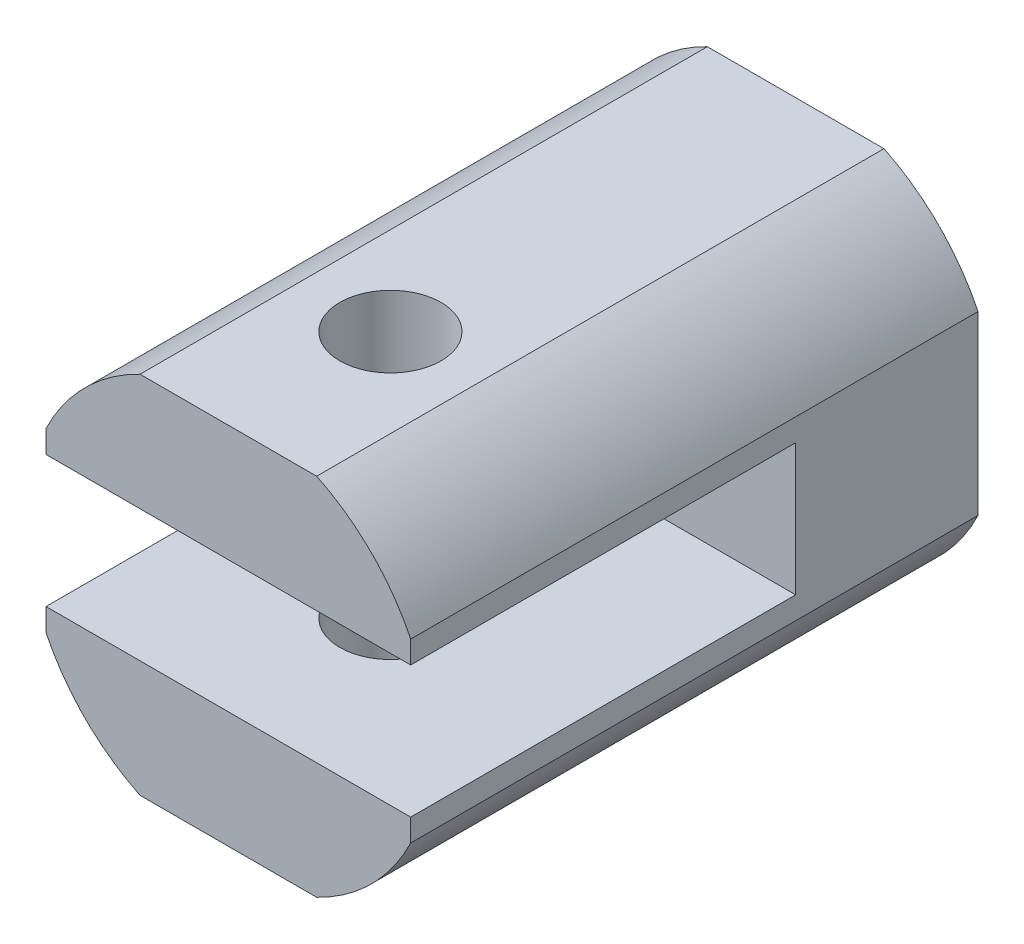
ISO-10303-21;
HEADER;
FILE_DESCRIPTION(('STEP AP214'),'2;1');
FILE_NAME('part.step','',(''),(''),'','','');
FILE_SCHEMA(('AUTOMOTIVE_DESIGN { 1 0 10303 214 1 1 1 1 }'));
ENDSEC;
DATA;
#1=APPLICATION_CONTEXT('core data for automotive mechanical design processes');
#2=APPLICATION_PROTOCOL_DEFINITION('international standard','automotive_design',2000,#1);
#3=PRODUCT_CONTEXT('',#1,'mechanical');
#4=PRODUCT('Part','Part','',(#3));
#5=PRODUCT_RELATED_PRODUCT_CATEGORY('part','',(#4));
#6=PRODUCT_DEFINITION_FORMATION('','',#4);
#7=PRODUCT_DEFINITION_CONTEXT('part definition',#1,'design');
#8=PRODUCT_DEFINITION('design','',#6,#7);
#9=PRODUCT_DEFINITION_SHAPE('','',#8);
#10=(LENGTH_UNIT() NAMED_UNIT(*) SI_UNIT(.MILLI.,.METRE.));
#11=(NAMED_UNIT(*) PLANE_ANGLE_UNIT() SI_UNIT($,.RADIAN.));
#12=(NAMED_UNIT(*) SI_UNIT($,.STERADIAN.) SOLID_ANGLE_UNIT());
#13=UNCERTAINTY_MEASURE_WITH_UNIT(LENGTH_MEASURE(1.E-05),#10,'distance_accuracy_value','');
#14=(GEOMETRIC_REPRESENTATION_CONTEXT(3) GLOBAL_UNCERTAINTY_ASSIGNED_CONTEXT((#13)) GLOBAL_UNIT_ASSIGNED_CONTEXT((#10,
#11,#12)) REPRESENTATION_CONTEXT('',''));
#15=CARTESIAN_POINT('',(0.,0.,0.));
#16=DIRECTION('',(0.,0.,1.));
#17=DIRECTION('',(1.,0.,0.));
#18=AXIS2_PLACEMENT_3D('',#15,#16,#17);
#19=CARTESIAN_POINT('',(0.,0.,0.));
#20=DIRECTION('',(0.,0.,1.));
#21=DIRECTION('',(1.,0.,0.));
#22=AXIS2_PLACEMENT_3D('',#19,#20,#21);
#23=PLANE('',#22);
#24=DIRECTION('',(1.,0.,0.));
#25=VECTOR('',#24,1.);
#26=CARTESIAN_POINT('',(-9.,-3.25,0.));
#27=LINE('',#26,#25);
#28=CARTESIAN_POINT('',(-9.,-3.25,0.));
#29=VERTEX_POINT('',#28);
#30=CARTESIAN_POINT('',(9.,-3.25,0.));
#31=VERTEX_POINT('',#30);
#32=EDGE_CURVE('E188',#29,#31,#27,.T.);
#33=ORIENTED_EDGE('',*,*,#32,.F.);
#34=DIRECTION('',(0.,-1.,0.));
#35=VECTOR('',#34,1.);
#36=CARTESIAN_POINT('',(-9.00000000000001,4.35889894354066,0.));
#37=LINE('',#36,#35);
#38=CARTESIAN_POINT('',(-9.00000000000001,-4.35889894354066,0.));
#39=VERTEX_POINT('',#38);
#40=EDGE_CURVE('E96',#29,#39,#37,.T.);
#41=ORIENTED_EDGE('',*,*,#40,.T.);
#42=CARTESIAN_POINT('',(0.,0.,0.));
#43=DIRECTION('',(0.,0.,1.));
#44=DIRECTION('',(1.,0.,0.));
#45=AXIS2_PLACEMENT_3D('',#42,#43,#44);
#46=CIRCLE('',#45,10.);
#47=CARTESIAN_POINT('',(-4.35889894354067,-9.,0.));
#48=VERTEX_POINT('',#47);
#49=EDGE_CURVE('E153',#39,#48,#46,.T.);
#50=ORIENTED_EDGE('',*,*,#49,.T.);
#51=DIRECTION('',(1.,0.,0.));
#52=VECTOR('',#51,1.);
#53=CARTESIAN_POINT('',(-4.35889894354067,-9.,0.));
#54=LINE('',#53,#52);
#55=CARTESIAN_POINT('',(4.35889894354067,-9.,0.));
#56=VERTEX_POINT('',#55);
#57=EDGE_CURVE('E155',#48,#56,#54,.T.);
#58=ORIENTED_EDGE('',*,*,#57,.T.);
#59=CARTESIAN_POINT('',(0.,0.,0.));
#60=DIRECTION('',(0.,0.,1.));
#61=DIRECTION('',(1.,0.,0.));
#62=AXIS2_PLACEMENT_3D('',#59,#60,#61);
#63=CIRCLE('',#62,10.);
#64=CARTESIAN_POINT('',(9.,-4.35889894354067,0.));
#65=VERTEX_POINT('',#64);
#66=EDGE_CURVE('E159',#56,#65,#63,.T.);
#67=ORIENTED_EDGE('',*,*,#66,.T.);
#68=DIRECTION('',(0.,1.,0.));
#69=VECTOR('',#68,1.);
#70=CARTESIAN_POINT('',(9.,4.35889894354067,0.));
#71=LINE('',#70,#69);
#72=EDGE_CURVE('E163',#65,#31,#71,.T.);
#73=ORIENTED_EDGE('',*,*,#72,.T.);
#74=EDGE_LOOP('',(#33,#41,#50,#58,#67,#73));
#75=FACE_BOUND('',#74,.T.);
#76=ADVANCED_FACE('F37',(#75),#23,.T.);
#77=CARTESIAN_POINT('',(0.,0.,-28.));
#78=DIRECTION('',(0.,0.,1.));
#79=DIRECTION('',(1.,0.,0.));
#80=AXIS2_PLACEMENT_3D('',#77,#78,#79);
#81=CYLINDRICAL_SURFACE('',#80,10.);
#82=ORIENTED_EDGE('',*,*,#49,.F.);
#83=DIRECTION('',(0.,0.,1.));
#84=VECTOR('',#83,1.);
#85=CARTESIAN_POINT('',(-9.00000000000001,-4.35889894354066,-28.));
#86=LINE('',#85,#84);
#87=CARTESIAN_POINT('',(-9.00000000000001,-4.35889894354066,-28.));
#88=VERTEX_POINT('',#87);
#89=EDGE_CURVE('E11',#88,#39,#86,.T.);
#90=ORIENTED_EDGE('',*,*,#89,.F.);
#91=CARTESIAN_POINT('',(0.,0.,-28.));
#92=DIRECTION('',(0.,0.,1.));
#93=DIRECTION('',(1.,0.,0.));
#94=AXIS2_PLACEMENT_3D('',#91,#92,#93);
#95=CIRCLE('',#94,10.);
#96=CARTESIAN_POINT('',(-4.35889894354067,-9.,-28.));
#97=VERTEX_POINT('',#96);
#98=EDGE_CURVE('E174',#88,#97,#95,.T.);
#99=ORIENTED_EDGE('',*,*,#98,.T.);
#100=DIRECTION('',(0.,0.,1.));
#101=VECTOR('',#100,1.);
#102=CARTESIAN_POINT('',(-4.35889894354067,-9.,-28.));
#103=LINE('',#102,#101);
#104=EDGE_CURVE('E103',#97,#48,#103,.T.);
#105=ORIENTED_EDGE('',*,*,#104,.T.);
#106=EDGE_LOOP('',(#82,#90,#99,#105));
#107=FACE_BOUND('',#106,.T.);
#108=ADVANCED_FACE('F39',(#107),#81,.T.);
#109=CARTESIAN_POINT('',(-9.00000000000001,4.35889894354066,-28.));
#110=DIRECTION('',(-1.,0.,0.));
#111=DIRECTION('',(0.,0.,1.));
#112=AXIS2_PLACEMENT_3D('',#109,#110,#111);
#113=PLANE('',#112);
#114=DIRECTION('',(0.,0.,1.));
#115=VECTOR('',#114,1.);
#116=CARTESIAN_POINT('',(-9.,-3.25,-19.));
#117=LINE('',#116,#115);
#118=CARTESIAN_POINT('',(-9.,-3.25,-19.));
#119=VERTEX_POINT('',#118);
#120=EDGE_CURVE('E235',#119,#29,#117,.T.);
#121=ORIENTED_EDGE('',*,*,#120,.F.);
#122=DIRECTION('',(0.,-1.,0.));
#123=VECTOR('',#122,1.);
#124=CARTESIAN_POINT('',(-9.,3.25,-19.));
#125=LINE('',#124,#123);
#126=CARTESIAN_POINT('',(-9.,3.25,-19.));
#127=VERTEX_POINT('',#126);
#128=EDGE_CURVE('E232',#127,#119,#125,.T.);
#129=ORIENTED_EDGE('',*,*,#128,.F.);
#130=DIRECTION('',(0.,0.,1.));
#131=VECTOR('',#130,1.);
#132=CARTESIAN_POINT('',(-9.,3.25,-19.));
#133=LINE('',#132,#131);
#134=CARTESIAN_POINT('',(-9.,3.25,0.));
#135=VERTEX_POINT('',#134);
#136=EDGE_CURVE('E229',#127,#135,#133,.T.);
#137=ORIENTED_EDGE('',*,*,#136,.T.);
#138=CARTESIAN_POINT('',(-9.00000000000001,4.35889894354066,0.));
#139=VERTEX_POINT('',#138);
#140=EDGE_CURVE('E172',#139,#135,#37,.T.);
#141=ORIENTED_EDGE('',*,*,#140,.F.);
#142=DIRECTION('',(0.,0.,1.));
#143=VECTOR('',#142,1.);
#144=CARTESIAN_POINT('',(-9.00000000000001,4.35889894354066,-28.));
#145=LINE('',#144,#143);
#146=CARTESIAN_POINT('',(-9.00000000000001,4.35889894354066,-28.));
#147=VERTEX_POINT('',#146);
#148=EDGE_CURVE('E46',#147,#139,#145,.T.);
#149=ORIENTED_EDGE('',*,*,#148,.F.);
#150=DIRECTION('',(0.,-1.,0.));
#151=VECTOR('',#150,1.);
#152=CARTESIAN_POINT('',(-9.00000000000001,4.35889894354066,-28.));
#153=LINE('',#152,#151);
#154=EDGE_CURVE('E143',#147,#88,#153,.T.);
#155=ORIENTED_EDGE('',*,*,#154,.T.);
#156=ORIENTED_EDGE('',*,*,#89,.T.);
#157=ORIENTED_EDGE('',*,*,#40,.F.);
#158=EDGE_LOOP('',(#121,#129,#137,#141,#149,#155,#156,#157));
#159=FACE_BOUND('',#158,.T.);
#160=ADVANCED_FACE('F195',(#159),#113,.T.);
#161=CARTESIAN_POINT('',(0.,0.,-28.));
#162=DIRECTION('',(0.,0.,1.));
#163=DIRECTION('',(1.,0.,0.));
#164=AXIS2_PLACEMENT_3D('',#161,#162,#163);
#165=CYLINDRICAL_SURFACE('',#164,10.);
#166=CARTESIAN_POINT('',(0.,0.,0.));
#167=DIRECTION('',(0.,0.,1.));
#168=DIRECTION('',(1.,0.,0.));
#169=AXIS2_PLACEMENT_3D('',#166,#167,#168);
#170=CIRCLE('',#169,10.);
#171=CARTESIAN_POINT('',(-4.35889894354067,9.,0.));
#172=VERTEX_POINT('',#171);
#173=EDGE_CURVE('E129',#172,#139,#170,.T.);
#174=ORIENTED_EDGE('',*,*,#173,.F.);
#175=DIRECTION('',(0.,0.,1.));
#176=VECTOR('',#175,1.);
#177=CARTESIAN_POINT('',(-4.35889894354067,9.,-28.));
#178=LINE('',#177,#176);
#179=CARTESIAN_POINT('',(-4.35889894354067,9.,-28.));
#180=VERTEX_POINT('',#179);
#181=EDGE_CURVE('E123',#180,#172,#178,.T.);
#182=ORIENTED_EDGE('',*,*,#181,.F.);
#183=CARTESIAN_POINT('',(0.,0.,-28.));
#184=DIRECTION('',(0.,0.,1.));
#185=DIRECTION('',(1.,0.,0.));
#186=AXIS2_PLACEMENT_3D('',#183,#184,#185);
#187=CIRCLE('',#186,10.);
#188=EDGE_CURVE('E126',#180,#147,#187,.T.);
#189=ORIENTED_EDGE('',*,*,#188,.T.);
#190=ORIENTED_EDGE('',*,*,#148,.T.);
#191=EDGE_LOOP('',(#174,#182,#189,#190));
#192=FACE_BOUND('',#191,.T.);
#193=ADVANCED_FACE('F125',(#192),#165,.T.);
#194=CARTESIAN_POINT('',(-4.35889894354067,9.,-28.));
#195=DIRECTION('',(0.,1.,0.));
#196=DIRECTION('',(0.,0.,1.));
#197=AXIS2_PLACEMENT_3D('',#194,#195,#196);
#198=PLANE('',#197);
#199=CARTESIAN_POINT('',(0.,9.,-8.));
#200=DIRECTION('',(0.,1.,0.));
#201=DIRECTION('',(0.,0.,1.));
#202=AXIS2_PLACEMENT_3D('',#199,#200,#201);
#203=CIRCLE('',#202,2.5);
#204=CARTESIAN_POINT('',(0.,9.,-5.5));
#205=VERTEX_POINT('',#204);
#206=EDGE_CURVE('E277',#205,#205,#203,.T.);
#207=ORIENTED_EDGE('',*,*,#206,.F.);
#208=EDGE_LOOP('',(#207));
#209=FACE_BOUND('',#208,.T.);
#210=DIRECTION('',(-1.,0.,0.));
#211=VECTOR('',#210,1.);
#212=CARTESIAN_POINT('',(-4.35889894354067,9.,0.));
#213=LINE('',#212,#211);
#214=CARTESIAN_POINT('',(4.35889894354067,9.,0.));
#215=VERTEX_POINT('',#214);
#216=EDGE_CURVE('E169',#215,#172,#213,.T.);
#217=ORIENTED_EDGE('',*,*,#216,.F.);
#218=DIRECTION('',(0.,0.,1.));
#219=VECTOR('',#218,1.);
#220=CARTESIAN_POINT('',(4.35889894354067,9.,-28.));
#221=LINE('',#220,#219);
#222=CARTESIAN_POINT('',(4.35889894354067,9.,-28.));
#223=VERTEX_POINT('',#222);
#224=EDGE_CURVE('E134',#223,#215,#221,.T.);
#225=ORIENTED_EDGE('',*,*,#224,.F.);
#226=DIRECTION('',(-1.,0.,0.));
#227=VECTOR('',#226,1.);
#228=CARTESIAN_POINT('',(-4.35889894354067,9.,-28.));
#229=LINE('',#228,#227);
#230=EDGE_CURVE('E140',#223,#180,#229,.T.);
#231=ORIENTED_EDGE('',*,*,#230,.T.);
#232=ORIENTED_EDGE('',*,*,#181,.T.);
#233=EDGE_LOOP('',(#217,#225,#231,#232));
#234=FACE_BOUND('',#233,.T.);
#235=ADVANCED_FACE('F145',(#209,#234),#198,.T.);
#236=CARTESIAN_POINT('',(0.,0.,-28.));
#237=DIRECTION('',(0.,0.,1.));
#238=DIRECTION('',(1.,0.,0.));
#239=AXIS2_PLACEMENT_3D('',#236,#237,#238);
#240=CYLINDRICAL_SURFACE('',#239,10.);
#241=CARTESIAN_POINT('',(0.,0.,0.));
#242=DIRECTION('',(0.,0.,1.));
#243=DIRECTION('',(1.,0.,0.));
#244=AXIS2_PLACEMENT_3D('',#241,#242,#243);
#245=CIRCLE('',#244,10.);
#246=CARTESIAN_POINT('',(9.,4.35889894354067,0.));
#247=VERTEX_POINT('',#246);
#248=EDGE_CURVE('E166',#247,#215,#245,.T.);
#249=ORIENTED_EDGE('',*,*,#248,.F.);
#250=DIRECTION('',(0.,0.,1.));
#251=VECTOR('',#250,1.);
#252=CARTESIAN_POINT('',(9.,4.35889894354067,-28.));
#253=LINE('',#252,#251);
#254=CARTESIAN_POINT('',(9.,4.35889894354067,-28.));
#255=VERTEX_POINT('',#254);
#256=EDGE_CURVE('E178',#255,#247,#253,.T.);
#257=ORIENTED_EDGE('',*,*,#256,.F.);
#258=CARTESIAN_POINT('',(0.,0.,-28.));
#259=DIRECTION('',(0.,0.,1.));
#260=DIRECTION('',(1.,0.,0.));
#261=AXIS2_PLACEMENT_3D('',#258,#259,#260);
#262=CIRCLE('',#261,10.);
#263=EDGE_CURVE('E146',#255,#223,#262,.T.);
#264=ORIENTED_EDGE('',*,*,#263,.T.);
#265=ORIENTED_EDGE('',*,*,#224,.T.);
#266=EDGE_LOOP('',(#249,#257,#264,#265));
#267=FACE_BOUND('',#266,.T.);
#268=ADVANCED_FACE('F225',(#267),#240,.T.);
#269=CARTESIAN_POINT('',(9.,4.35889894354067,-28.));
#270=DIRECTION('',(1.,0.,0.));
#271=DIRECTION('',(0.,1.,0.));
#272=AXIS2_PLACEMENT_3D('',#269,#270,#271);
#273=PLANE('',#272);
#274=DIRECTION('',(0.,0.,1.));
#275=VECTOR('',#274,1.);
#276=CARTESIAN_POINT('',(9.,-3.25,-19.));
#277=LINE('',#276,#275);
#278=CARTESIAN_POINT('',(9.,-3.25,-19.));
#279=VERTEX_POINT('',#278);
#280=EDGE_CURVE('E156',#279,#31,#277,.T.);
#281=ORIENTED_EDGE('',*,*,#280,.T.);
#282=ORIENTED_EDGE('',*,*,#72,.F.);
#283=DIRECTION('',(0.,0.,1.));
#284=VECTOR('',#283,1.);
#285=CARTESIAN_POINT('',(9.,-4.35889894354067,-28.));
#286=LINE('',#285,#284);
#287=CARTESIAN_POINT('',(9.,-4.35889894354067,-28.));
#288=VERTEX_POINT('',#287);
#289=EDGE_CURVE('E181',#288,#65,#286,.T.);
#290=ORIENTED_EDGE('',*,*,#289,.F.);
#291=DIRECTION('',(0.,1.,0.));
#292=VECTOR('',#291,1.);
#293=CARTESIAN_POINT('',(9.,4.35889894354067,-28.));
#294=LINE('',#293,#292);
#295=EDGE_CURVE('E148',#288,#255,#294,.T.);
#296=ORIENTED_EDGE('',*,*,#295,.T.);
#297=ORIENTED_EDGE('',*,*,#256,.T.);
#298=CARTESIAN_POINT('',(9.,3.25,0.));
#299=VERTEX_POINT('',#298);
#300=EDGE_CURVE('E162',#299,#247,#71,.T.);
#301=ORIENTED_EDGE('',*,*,#300,.F.);
#302=DIRECTION('',(0.,0.,1.));
#303=VECTOR('',#302,1.);
#304=CARTESIAN_POINT('',(9.,3.25,-19.));
#305=LINE('',#304,#303);
#306=CARTESIAN_POINT('',(9.,3.25,-19.));
#307=VERTEX_POINT('',#306);
#308=EDGE_CURVE('E54',#307,#299,#305,.T.);
#309=ORIENTED_EDGE('',*,*,#308,.F.);
#310=DIRECTION('',(0.,1.,0.));
#311=VECTOR('',#310,1.);
#312=CARTESIAN_POINT('',(9.,3.25,-19.));
#313=LINE('',#312,#311);
#314=EDGE_CURVE('E263',#279,#307,#313,.T.);
#315=ORIENTED_EDGE('',*,*,#314,.F.);
#316=EDGE_LOOP('',(#281,#282,#290,#296,#297,#301,#309,#315));
#317=FACE_BOUND('',#316,.T.);
#318=ADVANCED_FACE('F218',(#317),#273,.T.);
#319=CARTESIAN_POINT('',(0.,0.,-28.));
#320=DIRECTION('',(0.,0.,1.));
#321=DIRECTION('',(1.,0.,0.));
#322=AXIS2_PLACEMENT_3D('',#319,#320,#321);
#323=CYLINDRICAL_SURFACE('',#322,10.);
#324=ORIENTED_EDGE('',*,*,#66,.F.);
#325=DIRECTION('',(0.,0.,1.));
#326=VECTOR('',#325,1.);
#327=CARTESIAN_POINT('',(4.35889894354067,-9.,-28.));
#328=LINE('',#327,#326);
#329=CARTESIAN_POINT('',(4.35889894354067,-9.,-28.));
#330=VERTEX_POINT('',#329);
#331=EDGE_CURVE('E183',#330,#56,#328,.T.);
#332=ORIENTED_EDGE('',*,*,#331,.F.);
#333=CARTESIAN_POINT('',(0.,0.,-28.));
#334=DIRECTION('',(0.,0.,1.));
#335=DIRECTION('',(1.,0.,0.));
#336=AXIS2_PLACEMENT_3D('',#333,#334,#335);
#337=CIRCLE('',#336,10.);
#338=EDGE_CURVE('E246',#330,#288,#337,.T.);
#339=ORIENTED_EDGE('',*,*,#338,.T.);
#340=ORIENTED_EDGE('',*,*,#289,.T.);
#341=EDGE_LOOP('',(#324,#332,#339,#340));
#342=FACE_BOUND('',#341,.T.);
#343=ADVANCED_FACE('F250',(#342),#323,.T.);
#344=CARTESIAN_POINT('',(-4.35889894354067,-9.,-28.));
#345=DIRECTION('',(0.,-1.,0.));
#346=DIRECTION('',(0.,0.,-1.));
#347=AXIS2_PLACEMENT_3D('',#344,#345,#346);
#348=PLANE('',#347);
#349=CARTESIAN_POINT('',(0.,-9.,-8.));
#350=DIRECTION('',(0.,1.,0.));
#351=DIRECTION('',(0.,0.,1.));
#352=AXIS2_PLACEMENT_3D('',#349,#350,#351);
#353=CIRCLE('',#352,2.5);
#354=CARTESIAN_POINT('',(0.,-9.,-5.5));
#355=VERTEX_POINT('',#354);
#356=EDGE_CURVE('E274',#355,#355,#353,.T.);
#357=ORIENTED_EDGE('',*,*,#356,.T.);
#358=EDGE_LOOP('',(#357));
#359=FACE_BOUND('',#358,.T.);
#360=ORIENTED_EDGE('',*,*,#57,.F.);
#361=ORIENTED_EDGE('',*,*,#104,.F.);
#362=DIRECTION('',(1.,0.,0.));
#363=VECTOR('',#362,1.);
#364=CARTESIAN_POINT('',(-4.35889894354067,-9.,-28.));
#365=LINE('',#364,#363);
#366=EDGE_CURVE('E244',#97,#330,#365,.T.);
#367=ORIENTED_EDGE('',*,*,#366,.T.);
#368=ORIENTED_EDGE('',*,*,#331,.T.);
#369=EDGE_LOOP('',(#360,#361,#367,#368));
#370=FACE_BOUND('',#369,.T.);
#371=ADVANCED_FACE('F184',(#359,#370),#348,.T.);
#372=CARTESIAN_POINT('',(0.,0.,-28.));
#373=DIRECTION('',(0.,0.,1.));
#374=DIRECTION('',(1.,0.,0.));
#375=AXIS2_PLACEMENT_3D('',#372,#373,#374);
#376=PLANE('',#375);
#377=ORIENTED_EDGE('',*,*,#98,.F.);
#378=ORIENTED_EDGE('',*,*,#154,.F.);
#379=ORIENTED_EDGE('',*,*,#188,.F.);
#380=ORIENTED_EDGE('',*,*,#230,.F.);
#381=ORIENTED_EDGE('',*,*,#263,.F.);
#382=ORIENTED_EDGE('',*,*,#295,.F.);
#383=ORIENTED_EDGE('',*,*,#338,.F.);
#384=ORIENTED_EDGE('',*,*,#366,.F.);
#385=EDGE_LOOP('',(#377,#378,#379,#380,#381,#382,#383,#384));
#386=FACE_BOUND('',#385,.T.);
#387=ADVANCED_FACE('F138',(#386),#376,.F.);
#388=DIRECTION('',(-1.,0.,0.));
#389=VECTOR('',#388,1.);
#390=CARTESIAN_POINT('',(-9.,3.25,0.));
#391=LINE('',#390,#389);
#392=EDGE_CURVE('E208',#299,#135,#391,.T.);
#393=ORIENTED_EDGE('',*,*,#392,.F.);
#394=ORIENTED_EDGE('',*,*,#300,.T.);
#395=ORIENTED_EDGE('',*,*,#248,.T.);
#396=ORIENTED_EDGE('',*,*,#216,.T.);
#397=ORIENTED_EDGE('',*,*,#173,.T.);
#398=ORIENTED_EDGE('',*,*,#140,.T.);
#399=EDGE_LOOP('',(#393,#394,#395,#396,#397,#398));
#400=FACE_BOUND('',#399,.T.);
#401=ADVANCED_FACE('F191',(#400),#23,.T.);
#402=CARTESIAN_POINT('',(-9.,-3.25,-19.));
#403=DIRECTION('',(0.,-1.,0.));
#404=DIRECTION('',(0.,0.,-1.));
#405=AXIS2_PLACEMENT_3D('',#402,#403,#404);
#406=PLANE('',#405);
#407=CARTESIAN_POINT('',(0.,-3.25,-8.));
#408=DIRECTION('',(0.,-1.,0.));
#409=DIRECTION('',(0.,0.,-1.));
#410=AXIS2_PLACEMENT_3D('',#407,#408,#409);
#411=CIRCLE('',#410,2.5);
#412=CARTESIAN_POINT('',(0.,-3.25,-10.5));
#413=VERTEX_POINT('',#412);
#414=EDGE_CURVE('E214',#413,#413,#411,.T.);
#415=ORIENTED_EDGE('',*,*,#414,.T.);
#416=EDGE_LOOP('',(#415));
#417=FACE_BOUND('',#416,.T.);
#418=ORIENTED_EDGE('',*,*,#32,.T.);
#419=ORIENTED_EDGE('',*,*,#280,.F.);
#420=DIRECTION('',(1.,0.,0.));
#421=VECTOR('',#420,1.);
#422=CARTESIAN_POINT('',(-9.,-3.25,-19.));
#423=LINE('',#422,#421);
#424=EDGE_CURVE('E239',#119,#279,#423,.T.);
#425=ORIENTED_EDGE('',*,*,#424,.F.);
#426=ORIENTED_EDGE('',*,*,#120,.T.);
#427=EDGE_LOOP('',(#418,#419,#425,#426));
#428=FACE_BOUND('',#427,.T.);
#429=ADVANCED_FACE('F199',(#417,#428),#406,.F.);
#430=CARTESIAN_POINT('',(-9.,3.25,-19.));
#431=DIRECTION('',(0.,1.,0.));
#432=DIRECTION('',(0.,0.,1.));
#433=AXIS2_PLACEMENT_3D('',#430,#431,#432);
#434=PLANE('',#433);
#435=CARTESIAN_POINT('',(0.,3.25,-8.));
#436=DIRECTION('',(0.,1.,0.));
#437=DIRECTION('',(0.,0.,1.));
#438=AXIS2_PLACEMENT_3D('',#435,#436,#437);
#439=CIRCLE('',#438,2.5);
#440=CARTESIAN_POINT('',(0.,3.25,-5.5));
#441=VERTEX_POINT('',#440);
#442=EDGE_CURVE('E41',#441,#441,#439,.T.);
#443=ORIENTED_EDGE('',*,*,#442,.T.);
#444=EDGE_LOOP('',(#443));
#445=FACE_BOUND('',#444,.T.);
#446=ORIENTED_EDGE('',*,*,#392,.T.);
#447=ORIENTED_EDGE('',*,*,#136,.F.);
#448=DIRECTION('',(-1.,0.,0.));
#449=VECTOR('',#448,1.);
#450=CARTESIAN_POINT('',(-9.,3.25,-19.));
#451=LINE('',#450,#449);
#452=EDGE_CURVE('E260',#307,#127,#451,.T.);
#453=ORIENTED_EDGE('',*,*,#452,.F.);
#454=ORIENTED_EDGE('',*,*,#308,.T.);
#455=EDGE_LOOP('',(#446,#447,#453,#454));
#456=FACE_BOUND('',#455,.T.);
#457=ADVANCED_FACE('F205',(#445,#456),#434,.F.);
#458=CARTESIAN_POINT('',(0.,0.,-19.));
#459=DIRECTION('',(0.,0.,1.));
#460=DIRECTION('',(1.,0.,0.));
#461=AXIS2_PLACEMENT_3D('',#458,#459,#460);
#462=PLANE('',#461);
#463=ORIENTED_EDGE('',*,*,#314,.T.);
#464=ORIENTED_EDGE('',*,*,#452,.T.);
#465=ORIENTED_EDGE('',*,*,#128,.T.);
#466=ORIENTED_EDGE('',*,*,#424,.T.);
#467=EDGE_LOOP('',(#463,#464,#465,#466));
#468=FACE_BOUND('',#467,.T.);
#469=ADVANCED_FACE('F266',(#468),#462,.T.);
#470=CARTESIAN_POINT('',(0.,-9.,-8.));
#471=DIRECTION('',(0.,1.,0.));
#472=DIRECTION('',(0.,0.,1.));
#473=AXIS2_PLACEMENT_3D('',#470,#471,#472);
#474=CYLINDRICAL_SURFACE('',#473,2.5);
#475=ORIENTED_EDGE('',*,*,#206,.T.);
#476=EDGE_LOOP('',(#475));
#477=FACE_BOUND('',#476,.T.);
#478=ORIENTED_EDGE('',*,*,#442,.F.);
#479=EDGE_LOOP('',(#478));
#480=FACE_BOUND('',#479,.T.);
#481=ADVANCED_FACE('F281',(#477,#480),#474,.F.);
#482=ORIENTED_EDGE('',*,*,#356,.F.);
#483=EDGE_LOOP('',(#482));
#484=FACE_BOUND('',#483,.T.);
#485=ORIENTED_EDGE('',*,*,#414,.F.);
#486=EDGE_LOOP('',(#485));
#487=FACE_BOUND('',#486,.T.);
#488=ADVANCED_FACE('F302',(#484,#487),#474,.F.);
#489=CLOSED_SHELL('',(#76,#108,#160,#193,#235,#268,#318,#343,#371,#387,#401,#429,#457,#469,#481,#488));
#490=MANIFOLD_SOLID_BREP('B2',#489);
#491=ADVANCED_BREP_SHAPE_REPRESENTATION('',(#18,#490),#14);
#492=SHAPE_DEFINITION_REPRESENTATION(#9,#491);
ENDSEC;
END-ISO-10303-21;
